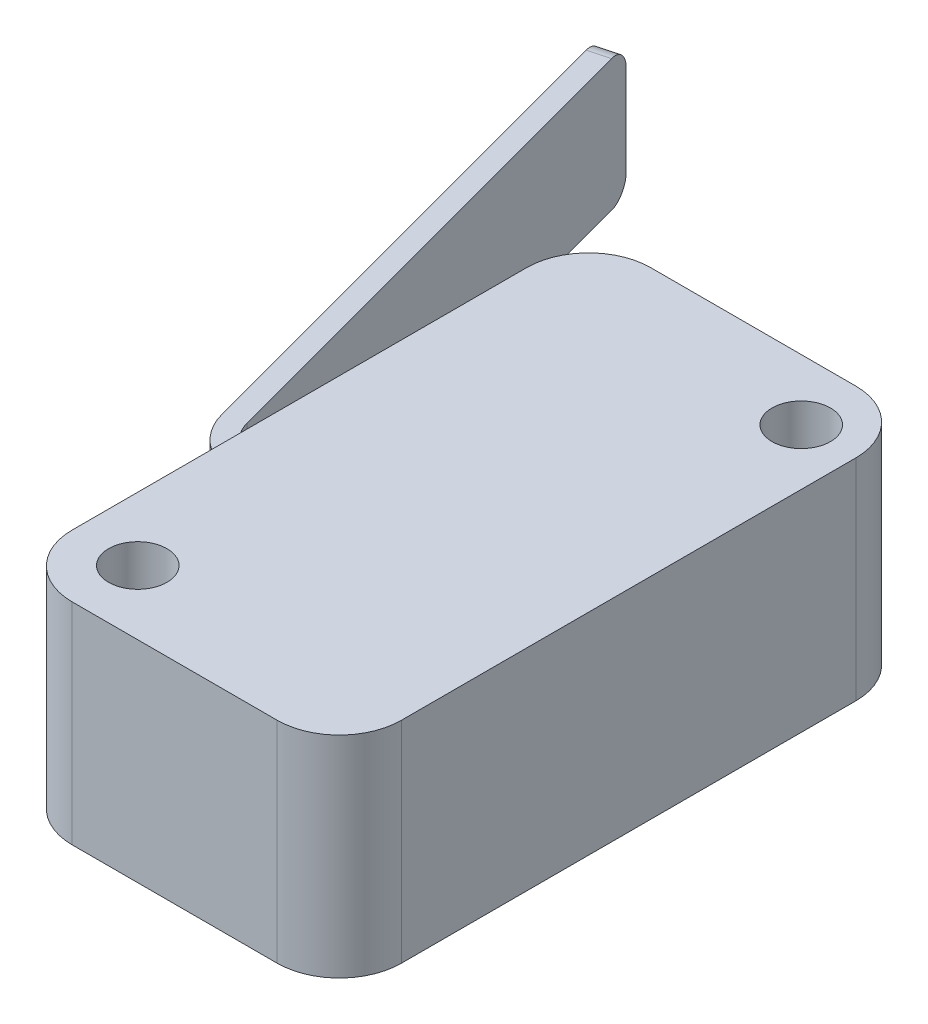
ISO-10303-21;
HEADER;
FILE_DESCRIPTION(('STEP AP214'),'2;1');
FILE_NAME('part.step','',(''),(''),'','','');
FILE_SCHEMA(('AUTOMOTIVE_DESIGN { 1 0 10303 214 1 1 1 1 }'));
ENDSEC;
DATA;
#1=APPLICATION_CONTEXT('core data for automotive mechanical design processes');
#2=APPLICATION_PROTOCOL_DEFINITION('international standard','automotive_design',2000,#1);
#3=PRODUCT_CONTEXT('',#1,'mechanical');
#4=PRODUCT('Part','Part','',(#3));
#5=PRODUCT_RELATED_PRODUCT_CATEGORY('part','',(#4));
#6=PRODUCT_DEFINITION_FORMATION('','',#4);
#7=PRODUCT_DEFINITION_CONTEXT('part definition',#1,'design');
#8=PRODUCT_DEFINITION('design','',#6,#7);
#9=PRODUCT_DEFINITION_SHAPE('','',#8);
#10=(LENGTH_UNIT() NAMED_UNIT(*) SI_UNIT(.MILLI.,.METRE.));
#11=(NAMED_UNIT(*) PLANE_ANGLE_UNIT() SI_UNIT($,.RADIAN.));
#12=(NAMED_UNIT(*) SI_UNIT($,.STERADIAN.) SOLID_ANGLE_UNIT());
#13=UNCERTAINTY_MEASURE_WITH_UNIT(LENGTH_MEASURE(1.E-05),#10,'distance_accuracy_value','');
#14=(GEOMETRIC_REPRESENTATION_CONTEXT(3) GLOBAL_UNCERTAINTY_ASSIGNED_CONTEXT((#13)) GLOBAL_UNIT_ASSIGNED_CONTEXT((#10,
#11,#12)) REPRESENTATION_CONTEXT('',''));
#15=CARTESIAN_POINT('',(0.,0.,0.));
#16=DIRECTION('',(0.,0.,1.));
#17=DIRECTION('',(1.,0.,0.));
#18=AXIS2_PLACEMENT_3D('',#15,#16,#17);
#19=CARTESIAN_POINT('',(-7.9502,5.08,13.97));
#20=DIRECTION('',(1.,0.,0.));
#21=DIRECTION('',(0.,0.,-1.));
#22=AXIS2_PLACEMENT_3D('',#19,#20,#21);
#23=PLANE('',#22);
#24=DIRECTION('',(0.,0.,1.));
#25=VECTOR('',#24,1.);
#26=CARTESIAN_POINT('',(-7.9502,5.08,13.97));
#27=LINE('',#26,#25);
#28=CARTESIAN_POINT('',(-7.9502,5.08,-10.97));
#29=VERTEX_POINT('',#28);
#30=CARTESIAN_POINT('',(-7.9502,5.08,10.97));
#31=VERTEX_POINT('',#30);
#32=EDGE_CURVE('E228',#29,#31,#27,.T.);
#33=ORIENTED_EDGE('',*,*,#32,.F.);
#34=DIRECTION('',(0.,-1.,0.));
#35=VECTOR('',#34,1.);
#36=CARTESIAN_POINT('',(-7.9502,5.08,-10.97));
#37=LINE('',#36,#35);
#38=CARTESIAN_POINT('',(-7.9502,-5.08,-10.97));
#39=VERTEX_POINT('',#38);
#40=EDGE_CURVE('E272',#29,#39,#37,.T.);
#41=ORIENTED_EDGE('',*,*,#40,.T.);
#42=DIRECTION('',(0.,0.,1.));
#43=VECTOR('',#42,1.);
#44=CARTESIAN_POINT('',(-7.9502,-5.08,13.97));
#45=LINE('',#44,#43);
#46=CARTESIAN_POINT('',(-7.9502,-5.08,10.97));
#47=VERTEX_POINT('',#46);
#48=EDGE_CURVE('E240',#39,#47,#45,.T.);
#49=ORIENTED_EDGE('',*,*,#48,.T.);
#50=DIRECTION('',(0.,-1.,0.));
#51=VECTOR('',#50,1.);
#52=CARTESIAN_POINT('',(-7.9502,5.08,10.97));
#53=LINE('',#52,#51);
#54=EDGE_CURVE('E270',#47,#31,#53,.F.);
#55=ORIENTED_EDGE('',*,*,#54,.T.);
#56=EDGE_LOOP('',(#33,#41,#49,#55));
#57=FACE_BOUND('',#56,.T.);
#58=DIRECTION('',(0.,0.,1.));
#59=VECTOR('',#58,1.);
#60=CARTESIAN_POINT('',(-7.9502,-3.175,13.97));
#61=LINE('',#60,#59);
#62=CARTESIAN_POINT('',(-7.9502,-3.175,1.84436190979496));
#63=VERTEX_POINT('',#62);
#64=CARTESIAN_POINT('',(-7.9502,-3.175,2.84436190979496));
#65=VERTEX_POINT('',#64);
#66=EDGE_CURVE('E289',#63,#65,#61,.T.);
#67=ORIENTED_EDGE('',*,*,#66,.F.);
#68=DIRECTION('',(0.,1.,0.));
#69=VECTOR('',#68,1.);
#70=CARTESIAN_POINT('',(-7.9502,5.08,1.84436190979496));
#71=LINE('',#70,#69);
#72=CARTESIAN_POINT('',(-7.9502,3.175,1.84436190979496));
#73=VERTEX_POINT('',#72);
#74=EDGE_CURVE('E286',#63,#73,#71,.T.);
#75=ORIENTED_EDGE('',*,*,#74,.T.);
#76=DIRECTION('',(0.,0.,1.));
#77=VECTOR('',#76,1.);
#78=CARTESIAN_POINT('',(-7.9502,3.175,13.97));
#79=LINE('',#78,#77);
#80=CARTESIAN_POINT('',(-7.9502,3.175,2.84436190979496));
#81=VERTEX_POINT('',#80);
#82=EDGE_CURVE('E280',#73,#81,#79,.T.);
#83=ORIENTED_EDGE('',*,*,#82,.T.);
#84=DIRECTION('',(0.,-1.,0.));
#85=VECTOR('',#84,1.);
#86=CARTESIAN_POINT('',(-7.9502,5.08,2.84436190979496));
#87=LINE('',#86,#85);
#88=EDGE_CURVE('E283',#81,#65,#87,.T.);
#89=ORIENTED_EDGE('',*,*,#88,.T.);
#90=EDGE_LOOP('',(#67,#75,#83,#89));
#91=FACE_BOUND('',#90,.T.);
#92=ADVANCED_FACE('F33',(#57,#91),#23,.F.);
#93=CARTESIAN_POINT('',(7.9502,5.08,13.97));
#94=DIRECTION('',(-1.,0.,0.));
#95=DIRECTION('',(0.,0.,1.));
#96=AXIS2_PLACEMENT_3D('',#93,#94,#95);
#97=PLANE('',#96);
#98=DIRECTION('',(0.,0.,-1.));
#99=VECTOR('',#98,1.);
#100=CARTESIAN_POINT('',(7.9502,-5.08,13.97));
#101=LINE('',#100,#99);
#102=CARTESIAN_POINT('',(7.9502,-5.08,10.97));
#103=VERTEX_POINT('',#102);
#104=CARTESIAN_POINT('',(7.9502,-5.08,-10.97));
#105=VERTEX_POINT('',#104);
#106=EDGE_CURVE('E212',#103,#105,#101,.T.);
#107=ORIENTED_EDGE('',*,*,#106,.T.);
#108=DIRECTION('',(0.,-1.,0.));
#109=VECTOR('',#108,1.);
#110=CARTESIAN_POINT('',(7.9502,5.08,-10.97));
#111=LINE('',#110,#109);
#112=CARTESIAN_POINT('',(7.9502,5.08,-10.97));
#113=VERTEX_POINT('',#112);
#114=EDGE_CURVE('E260',#105,#113,#111,.F.);
#115=ORIENTED_EDGE('',*,*,#114,.T.);
#116=DIRECTION('',(0.,0.,-1.));
#117=VECTOR('',#116,1.);
#118=CARTESIAN_POINT('',(7.9502,5.08,13.97));
#119=LINE('',#118,#117);
#120=CARTESIAN_POINT('',(7.9502,5.08,10.97));
#121=VERTEX_POINT('',#120);
#122=EDGE_CURVE('E221',#121,#113,#119,.T.);
#123=ORIENTED_EDGE('',*,*,#122,.F.);
#124=DIRECTION('',(0.,-1.,0.));
#125=VECTOR('',#124,1.);
#126=CARTESIAN_POINT('',(7.9502,5.08,10.97));
#127=LINE('',#126,#125);
#128=EDGE_CURVE('E257',#121,#103,#127,.T.);
#129=ORIENTED_EDGE('',*,*,#128,.T.);
#130=EDGE_LOOP('',(#107,#115,#123,#129));
#131=FACE_BOUND('',#130,.T.);
#132=ADVANCED_FACE('F358',(#131),#97,.F.);
#133=CARTESIAN_POINT('',(-7.9502,5.08,-13.97));
#134=DIRECTION('',(0.,0.,1.));
#135=DIRECTION('',(1.,0.,0.));
#136=AXIS2_PLACEMENT_3D('',#133,#134,#135);
#137=PLANE('',#136);
#138=DIRECTION('',(-1.,0.,0.));
#139=VECTOR('',#138,1.);
#140=CARTESIAN_POINT('',(-7.9502,5.08,-13.97));
#141=LINE('',#140,#139);
#142=CARTESIAN_POINT('',(4.9502,5.08,-13.97));
#143=VERTEX_POINT('',#142);
#144=CARTESIAN_POINT('',(-4.9502,5.08,-13.97));
#145=VERTEX_POINT('',#144);
#146=EDGE_CURVE('E224',#143,#145,#141,.T.);
#147=ORIENTED_EDGE('',*,*,#146,.F.);
#148=DIRECTION('',(0.,-1.,0.));
#149=VECTOR('',#148,1.);
#150=CARTESIAN_POINT('',(4.9502,5.08,-13.97));
#151=LINE('',#150,#149);
#152=CARTESIAN_POINT('',(4.9502,-5.08,-13.97));
#153=VERTEX_POINT('',#152);
#154=EDGE_CURVE('E246',#143,#153,#151,.T.);
#155=ORIENTED_EDGE('',*,*,#154,.T.);
#156=DIRECTION('',(-1.,0.,0.));
#157=VECTOR('',#156,1.);
#158=CARTESIAN_POINT('',(-7.9502,-5.08,-13.97));
#159=LINE('',#158,#157);
#160=CARTESIAN_POINT('',(-4.9502,-5.08,-13.97));
#161=VERTEX_POINT('',#160);
#162=EDGE_CURVE('E237',#153,#161,#159,.T.);
#163=ORIENTED_EDGE('',*,*,#162,.T.);
#164=DIRECTION('',(0.,-1.,0.));
#165=VECTOR('',#164,1.);
#166=CARTESIAN_POINT('',(-4.9502,5.08,-13.97));
#167=LINE('',#166,#165);
#168=EDGE_CURVE('E234',#161,#145,#167,.F.);
#169=ORIENTED_EDGE('',*,*,#168,.T.);
#170=EDGE_LOOP('',(#147,#155,#163,#169));
#171=FACE_BOUND('',#170,.T.);
#172=ADVANCED_FACE('F335',(#171),#137,.F.);
#173=CARTESIAN_POINT('',(-7.9502,5.08,13.97));
#174=DIRECTION('',(0.,0.,-1.));
#175=DIRECTION('',(-1.,0.,0.));
#176=AXIS2_PLACEMENT_3D('',#173,#174,#175);
#177=PLANE('',#176);
#178=DIRECTION('',(1.,0.,0.));
#179=VECTOR('',#178,1.);
#180=CARTESIAN_POINT('',(-7.9502,-5.08,13.97));
#181=LINE('',#180,#179);
#182=CARTESIAN_POINT('',(-4.9502,-5.08,13.97));
#183=VERTEX_POINT('',#182);
#184=CARTESIAN_POINT('',(4.9502,-5.08,13.97));
#185=VERTEX_POINT('',#184);
#186=EDGE_CURVE('E225',#183,#185,#181,.T.);
#187=ORIENTED_EDGE('',*,*,#186,.T.);
#188=DIRECTION('',(0.,-1.,0.));
#189=VECTOR('',#188,1.);
#190=CARTESIAN_POINT('',(4.9502,5.08,13.97));
#191=LINE('',#190,#189);
#192=CARTESIAN_POINT('',(4.9502,5.08,13.97));
#193=VERTEX_POINT('',#192);
#194=EDGE_CURVE('E278',#185,#193,#191,.F.);
#195=ORIENTED_EDGE('',*,*,#194,.T.);
#196=DIRECTION('',(1.,0.,0.));
#197=VECTOR('',#196,1.);
#198=CARTESIAN_POINT('',(-7.9502,5.08,13.97));
#199=LINE('',#198,#197);
#200=CARTESIAN_POINT('',(-4.9502,5.08,13.97));
#201=VERTEX_POINT('',#200);
#202=EDGE_CURVE('E231',#201,#193,#199,.T.);
#203=ORIENTED_EDGE('',*,*,#202,.F.);
#204=DIRECTION('',(0.,-1.,0.));
#205=VECTOR('',#204,1.);
#206=CARTESIAN_POINT('',(-4.9502,5.08,13.97));
#207=LINE('',#206,#205);
#208=EDGE_CURVE('E275',#201,#183,#207,.T.);
#209=ORIENTED_EDGE('',*,*,#208,.T.);
#210=EDGE_LOOP('',(#187,#195,#203,#209));
#211=FACE_BOUND('',#210,.T.);
#212=ADVANCED_FACE('F320',(#211),#177,.F.);
#213=CARTESIAN_POINT('',(0.,5.08,0.));
#214=DIRECTION('',(0.,-1.,0.));
#215=DIRECTION('',(0.,0.,-1.));
#216=AXIS2_PLACEMENT_3D('',#213,#214,#215);
#217=PLANE('',#216);
#218=CARTESIAN_POINT('',(-4.88443082864765,5.08,10.8661080622666));
#219=DIRECTION('',(0.,1.,0.));
#220=DIRECTION('',(0.,0.,1.));
#221=AXIS2_PLACEMENT_3D('',#218,#219,#220);
#222=CIRCLE('',#221,1.4097);
#223=CARTESIAN_POINT('',(-4.88443082864765,5.08,12.2758080622667));
#224=VERTEX_POINT('',#223);
#225=EDGE_CURVE('E309',#224,#224,#222,.T.);
#226=ORIENTED_EDGE('',*,*,#225,.F.);
#227=EDGE_LOOP('',(#226));
#228=FACE_BOUND('',#227,.T.);
#229=CARTESIAN_POINT('',(5.2482497851196,5.08,-11.0333367612759));
#230=DIRECTION('',(0.,1.,0.));
#231=DIRECTION('',(0.,0.,1.));
#232=AXIS2_PLACEMENT_3D('',#229,#230,#231);
#233=CIRCLE('',#232,1.4097);
#234=CARTESIAN_POINT('',(5.2482497851196,5.08,-9.62363676127591));
#235=VERTEX_POINT('',#234);
#236=EDGE_CURVE('E302',#235,#235,#233,.T.);
#237=ORIENTED_EDGE('',*,*,#236,.F.);
#238=EDGE_LOOP('',(#237));
#239=FACE_BOUND('',#238,.T.);
#240=ORIENTED_EDGE('',*,*,#122,.T.);
#241=CARTESIAN_POINT('',(4.9502,5.08,-10.97));
#242=DIRECTION('',(0.,-1.,0.));
#243=DIRECTION('',(0.,0.,-1.));
#244=AXIS2_PLACEMENT_3D('',#241,#242,#243);
#245=CIRCLE('',#244,3.);
#246=EDGE_CURVE('E268',#113,#143,#245,.F.);
#247=ORIENTED_EDGE('',*,*,#246,.T.);
#248=ORIENTED_EDGE('',*,*,#146,.T.);
#249=CARTESIAN_POINT('',(-4.9502,5.08,-10.97));
#250=DIRECTION('',(0.,-1.,0.));
#251=DIRECTION('',(0.,0.,-1.));
#252=AXIS2_PLACEMENT_3D('',#249,#250,#251);
#253=CIRCLE('',#252,3.);
#254=EDGE_CURVE('E266',#145,#29,#253,.F.);
#255=ORIENTED_EDGE('',*,*,#254,.T.);
#256=ORIENTED_EDGE('',*,*,#32,.T.);
#257=CARTESIAN_POINT('',(-4.9502,5.08,10.97));
#258=DIRECTION('',(0.,-1.,0.));
#259=DIRECTION('',(0.,0.,-1.));
#260=AXIS2_PLACEMENT_3D('',#257,#258,#259);
#261=CIRCLE('',#260,3.);
#262=EDGE_CURVE('E262',#31,#201,#261,.F.);
#263=ORIENTED_EDGE('',*,*,#262,.T.);
#264=ORIENTED_EDGE('',*,*,#202,.T.);
#265=CARTESIAN_POINT('',(4.9502,5.08,10.97));
#266=DIRECTION('',(0.,-1.,0.));
#267=DIRECTION('',(0.,0.,-1.));
#268=AXIS2_PLACEMENT_3D('',#265,#266,#267);
#269=CIRCLE('',#268,3.);
#270=EDGE_CURVE('E264',#193,#121,#269,.F.);
#271=ORIENTED_EDGE('',*,*,#270,.T.);
#272=EDGE_LOOP('',(#240,#247,#248,#255,#256,#263,#264,#271));
#273=FACE_BOUND('',#272,.T.);
#274=ADVANCED_FACE('F316',(#228,#239,#273),#217,.F.);
#275=CARTESIAN_POINT('',(0.,-5.08,0.));
#276=DIRECTION('',(0.,-1.,0.));
#277=DIRECTION('',(0.,0.,-1.));
#278=AXIS2_PLACEMENT_3D('',#275,#276,#277);
#279=PLANE('',#278);
#280=CARTESIAN_POINT('',(-4.88443082864765,-5.08,10.8661080622666));
#281=DIRECTION('',(0.,-1.,0.));
#282=DIRECTION('',(0.,0.,-1.));
#283=AXIS2_PLACEMENT_3D('',#280,#281,#282);
#284=CIRCLE('',#283,1.4097);
#285=CARTESIAN_POINT('',(-4.88443082864765,-5.08,9.45640806226665));
#286=VERTEX_POINT('',#285);
#287=EDGE_CURVE('E37',#286,#286,#284,.T.);
#288=ORIENTED_EDGE('',*,*,#287,.F.);
#289=EDGE_LOOP('',(#288));
#290=FACE_BOUND('',#289,.T.);
#291=CARTESIAN_POINT('',(5.2482497851196,-5.08,-11.0333367612759));
#292=DIRECTION('',(0.,-1.,0.));
#293=DIRECTION('',(0.,0.,-1.));
#294=AXIS2_PLACEMENT_3D('',#291,#292,#293);
#295=CIRCLE('',#294,1.4097);
#296=CARTESIAN_POINT('',(5.2482497851196,-5.08,-12.4430367612759));
#297=VERTEX_POINT('',#296);
#298=EDGE_CURVE('E200',#297,#297,#295,.T.);
#299=ORIENTED_EDGE('',*,*,#298,.F.);
#300=EDGE_LOOP('',(#299));
#301=FACE_BOUND('',#300,.T.);
#302=ORIENTED_EDGE('',*,*,#162,.F.);
#303=CARTESIAN_POINT('',(4.9502,-5.08,-10.97));
#304=DIRECTION('',(0.,-1.,0.));
#305=DIRECTION('',(0.,0.,-1.));
#306=AXIS2_PLACEMENT_3D('',#303,#304,#305);
#307=CIRCLE('',#306,3.);
#308=EDGE_CURVE('E255',#153,#105,#307,.T.);
#309=ORIENTED_EDGE('',*,*,#308,.T.);
#310=ORIENTED_EDGE('',*,*,#106,.F.);
#311=CARTESIAN_POINT('',(4.9502,-5.08,10.97));
#312=DIRECTION('',(0.,-1.,0.));
#313=DIRECTION('',(0.,0.,-1.));
#314=AXIS2_PLACEMENT_3D('',#311,#312,#313);
#315=CIRCLE('',#314,3.);
#316=EDGE_CURVE('E251',#103,#185,#315,.T.);
#317=ORIENTED_EDGE('',*,*,#316,.T.);
#318=ORIENTED_EDGE('',*,*,#186,.F.);
#319=CARTESIAN_POINT('',(-4.9502,-5.08,10.97));
#320=DIRECTION('',(0.,-1.,0.));
#321=DIRECTION('',(0.,0.,-1.));
#322=AXIS2_PLACEMENT_3D('',#319,#320,#321);
#323=CIRCLE('',#322,3.);
#324=EDGE_CURVE('E249',#183,#47,#323,.T.);
#325=ORIENTED_EDGE('',*,*,#324,.T.);
#326=ORIENTED_EDGE('',*,*,#48,.F.);
#327=CARTESIAN_POINT('',(-4.9502,-5.08,-10.97));
#328=DIRECTION('',(0.,-1.,0.));
#329=DIRECTION('',(0.,0.,-1.));
#330=AXIS2_PLACEMENT_3D('',#327,#328,#329);
#331=CIRCLE('',#330,3.);
#332=EDGE_CURVE('E253',#39,#161,#331,.T.);
#333=ORIENTED_EDGE('',*,*,#332,.T.);
#334=EDGE_LOOP('',(#302,#309,#310,#317,#318,#325,#326,#333));
#335=FACE_BOUND('',#334,.T.);
#336=ADVANCED_FACE('F319',(#290,#301,#335),#279,.T.);
#337=CARTESIAN_POINT('',(4.9502,5.08,-10.97));
#338=DIRECTION('',(0.,-1.,0.));
#339=DIRECTION('',(0.,0.,-1.));
#340=AXIS2_PLACEMENT_3D('',#337,#338,#339);
#341=CYLINDRICAL_SURFACE('',#340,3.);
#342=ORIENTED_EDGE('',*,*,#246,.F.);
#343=ORIENTED_EDGE('',*,*,#114,.F.);
#344=ORIENTED_EDGE('',*,*,#308,.F.);
#345=ORIENTED_EDGE('',*,*,#154,.F.);
#346=EDGE_LOOP('',(#342,#343,#344,#345));
#347=FACE_BOUND('',#346,.T.);
#348=ADVANCED_FACE('F332',(#347),#341,.T.);
#349=CARTESIAN_POINT('',(-4.9502,5.08,-10.97));
#350=DIRECTION('',(0.,-1.,0.));
#351=DIRECTION('',(0.,0.,-1.));
#352=AXIS2_PLACEMENT_3D('',#349,#350,#351);
#353=CYLINDRICAL_SURFACE('',#352,3.);
#354=ORIENTED_EDGE('',*,*,#254,.F.);
#355=ORIENTED_EDGE('',*,*,#168,.F.);
#356=ORIENTED_EDGE('',*,*,#332,.F.);
#357=ORIENTED_EDGE('',*,*,#40,.F.);
#358=EDGE_LOOP('',(#354,#355,#356,#357));
#359=FACE_BOUND('',#358,.T.);
#360=ADVANCED_FACE('F343',(#359),#353,.T.);
#361=CARTESIAN_POINT('',(4.9502,5.08,10.97));
#362=DIRECTION('',(0.,-1.,0.));
#363=DIRECTION('',(0.,0.,-1.));
#364=AXIS2_PLACEMENT_3D('',#361,#362,#363);
#365=CYLINDRICAL_SURFACE('',#364,3.);
#366=ORIENTED_EDGE('',*,*,#270,.F.);
#367=ORIENTED_EDGE('',*,*,#194,.F.);
#368=ORIENTED_EDGE('',*,*,#316,.F.);
#369=ORIENTED_EDGE('',*,*,#128,.F.);
#370=EDGE_LOOP('',(#366,#367,#368,#369));
#371=FACE_BOUND('',#370,.T.);
#372=ADVANCED_FACE('F357',(#371),#365,.T.);
#373=CARTESIAN_POINT('',(-4.9502,5.08,10.97));
#374=DIRECTION('',(0.,-1.,0.));
#375=DIRECTION('',(0.,0.,-1.));
#376=AXIS2_PLACEMENT_3D('',#373,#374,#375);
#377=CYLINDRICAL_SURFACE('',#376,3.);
#378=ORIENTED_EDGE('',*,*,#262,.F.);
#379=ORIENTED_EDGE('',*,*,#54,.F.);
#380=ORIENTED_EDGE('',*,*,#324,.F.);
#381=ORIENTED_EDGE('',*,*,#208,.F.);
#382=EDGE_LOOP('',(#378,#379,#380,#381));
#383=FACE_BOUND('',#382,.T.);
#384=ADVANCED_FACE('F352',(#383),#377,.T.);
#385=CARTESIAN_POINT('',(-8.17666771892309,-3.175,1.84436190979496));
#386=DIRECTION('',(0.,0.,-1.));
#387=DIRECTION('',(-1.,0.,0.));
#388=AXIS2_PLACEMENT_3D('',#385,#386,#387);
#389=PLANE('',#388);
#390=ORIENTED_EDGE('',*,*,#74,.F.);
#391=DIRECTION('',(-1.,0.,0.));
#392=VECTOR('',#391,1.);
#393=CARTESIAN_POINT('',(-8.17666771892309,-3.175,1.84436190979496));
#394=LINE('',#393,#392);
#395=CARTESIAN_POINT('',(-8.17666771892309,-3.175,1.84436190979496));
#396=VERTEX_POINT('',#395);
#397=EDGE_CURVE('E188',#63,#396,#394,.T.);
#398=ORIENTED_EDGE('',*,*,#397,.T.);
#399=DIRECTION('',(0.,1.,0.));
#400=VECTOR('',#399,1.);
#401=CARTESIAN_POINT('',(-8.17666771892309,-3.175,1.84436190979496));
#402=LINE('',#401,#400);
#403=CARTESIAN_POINT('',(-8.17666771892309,3.175,1.84436190979496));
#404=VERTEX_POINT('',#403);
#405=EDGE_CURVE('E215',#396,#404,#402,.T.);
#406=ORIENTED_EDGE('',*,*,#405,.T.);
#407=DIRECTION('',(-1.,0.,0.));
#408=VECTOR('',#407,1.);
#409=CARTESIAN_POINT('',(-8.17666771892309,3.175,1.84436190979496));
#410=LINE('',#409,#408);
#411=EDGE_CURVE('E204',#73,#404,#410,.T.);
#412=ORIENTED_EDGE('',*,*,#411,.F.);
#413=EDGE_LOOP('',(#390,#398,#406,#412));
#414=FACE_BOUND('',#413,.T.);
#415=ADVANCED_FACE('F375',(#414),#389,.T.);
#416=CARTESIAN_POINT('',(-8.17666771892309,-3.175,2.84436190979496));
#417=DIRECTION('',(0.,0.,1.));
#418=DIRECTION('',(1.,0.,0.));
#419=AXIS2_PLACEMENT_3D('',#416,#417,#418);
#420=PLANE('',#419);
#421=ORIENTED_EDGE('',*,*,#88,.F.);
#422=DIRECTION('',(1.,0.,0.));
#423=VECTOR('',#422,1.);
#424=CARTESIAN_POINT('',(-8.17666771892309,3.175,2.84436190979496));
#425=LINE('',#424,#423);
#426=CARTESIAN_POINT('',(-8.17666771892309,3.175,2.84436190979496));
#427=VERTEX_POINT('',#426);
#428=EDGE_CURVE('E202',#427,#81,#425,.T.);
#429=ORIENTED_EDGE('',*,*,#428,.F.);
#430=DIRECTION('',(0.,1.,0.));
#431=VECTOR('',#430,1.);
#432=CARTESIAN_POINT('',(-8.17666771892309,-3.175,2.84436190979496));
#433=LINE('',#432,#431);
#434=CARTESIAN_POINT('',(-8.17666771892309,-3.175,2.84436190979496));
#435=VERTEX_POINT('',#434);
#436=EDGE_CURVE('E180',#435,#427,#433,.T.);
#437=ORIENTED_EDGE('',*,*,#436,.F.);
#438=DIRECTION('',(1.,0.,0.));
#439=VECTOR('',#438,1.);
#440=CARTESIAN_POINT('',(-8.17666771892309,-3.175,2.84436190979496));
#441=LINE('',#440,#439);
#442=EDGE_CURVE('E186',#435,#65,#441,.T.);
#443=ORIENTED_EDGE('',*,*,#442,.T.);
#444=EDGE_LOOP('',(#421,#429,#437,#443));
#445=FACE_BOUND('',#444,.T.);
#446=ADVANCED_FACE('F407',(#445),#420,.T.);
#447=CARTESIAN_POINT('',(-8.17666771892309,-3.175,-0.155638090205042));
#448=DIRECTION('',(0.,1.,0.));
#449=DIRECTION('',(0.,0.,1.));
#450=AXIS2_PLACEMENT_3D('',#447,#448,#449);
#451=PLANE('',#450);
#452=DIRECTION('',(0.258819045102521,0.,0.965925826289068));
#453=VECTOR('',#452,1.);
#454=CARTESIAN_POINT('',(-17.7731750085684,-3.175,-24.3791809548975));
#455=LINE('',#454,#453);
#456=CARTESIAN_POINT('',(-17.5143559634659,-3.175,-23.4132551286084));
#457=VERTEX_POINT('',#456);
#458=CARTESIAN_POINT('',(-11.0744451977903,-3.175,0.620819045102524));
#459=VERTEX_POINT('',#458);
#460=EDGE_CURVE('E163',#457,#459,#455,.T.);
#461=ORIENTED_EDGE('',*,*,#460,.F.);
#462=DIRECTION('',(-0.965925826289068,0.,0.258819045102524));
#463=VECTOR('',#462,1.);
#464=CARTESIAN_POINT('',(-16.5484301371768,-3.175,-23.6720741737109));
#465=LINE('',#464,#463);
#466=CARTESIAN_POINT('',(-16.5484301371768,-3.175,-23.6720741737109));
#467=VERTEX_POINT('',#466);
#468=EDGE_CURVE('E58',#457,#467,#465,.F.);
#469=ORIENTED_EDGE('',*,*,#468,.T.);
#470=DIRECTION('',(-0.258819045102522,0.,-0.965925826289068));
#471=VECTOR('',#470,1.);
#472=CARTESIAN_POINT('',(-16.8072491822793,-3.175,-24.638));
#473=LINE('',#472,#471);
#474=CARTESIAN_POINT('',(-10.1085193715012,-3.175,0.362000000000008));
#475=VERTEX_POINT('',#474);
#476=EDGE_CURVE('E196',#475,#467,#473,.T.);
#477=ORIENTED_EDGE('',*,*,#476,.F.);
#478=CARTESIAN_POINT('',(-8.17666771892309,-3.175,-0.155638090205042));
#479=DIRECTION('',(0.,-1.,0.));
#480=DIRECTION('',(0.,0.,1.));
#481=AXIS2_PLACEMENT_3D('',#478,#479,#480);
#482=CIRCLE('',#481,2.);
#483=EDGE_CURVE('E193',#396,#475,#482,.T.);
#484=ORIENTED_EDGE('',*,*,#483,.F.);
#485=ORIENTED_EDGE('',*,*,#397,.F.);
#486=ORIENTED_EDGE('',*,*,#66,.T.);
#487=ORIENTED_EDGE('',*,*,#442,.F.);
#488=CARTESIAN_POINT('',(-8.17666771892309,-3.175,-0.155638090205042));
#489=DIRECTION('',(0.,1.,0.));
#490=DIRECTION('',(0.,0.,1.));
#491=AXIS2_PLACEMENT_3D('',#488,#489,#490);
#492=CIRCLE('',#491,3.);
#493=EDGE_CURVE('E172',#459,#435,#492,.T.);
#494=ORIENTED_EDGE('',*,*,#493,.F.);
#495=EDGE_LOOP('',(#461,#469,#477,#484,#485,#486,#487,#494));
#496=FACE_BOUND('',#495,.T.);
#497=ADVANCED_FACE('F184',(#496),#451,.F.);
#498=CARTESIAN_POINT('',(-8.17666771892309,3.175,-0.155638090205042));
#499=DIRECTION('',(0.,1.,0.));
#500=DIRECTION('',(0.,0.,1.));
#501=AXIS2_PLACEMENT_3D('',#498,#499,#500);
#502=PLANE('',#501);
#503=DIRECTION('',(-0.258819045102522,0.,-0.965925826289068));
#504=VECTOR('',#503,1.);
#505=CARTESIAN_POINT('',(-16.8072491822793,3.175,-24.638));
#506=LINE('',#505,#504);
#507=CARTESIAN_POINT('',(-10.1085193715012,3.175,0.362000000000008));
#508=VERTEX_POINT('',#507);
#509=CARTESIAN_POINT('',(-16.5484301371768,3.175,-23.6720741737109));
#510=VERTEX_POINT('',#509);
#511=EDGE_CURVE('E173',#508,#510,#506,.T.);
#512=ORIENTED_EDGE('',*,*,#511,.T.);
#513=DIRECTION('',(-0.965925826289068,0.,0.258819045102524));
#514=VECTOR('',#513,1.);
#515=CARTESIAN_POINT('',(-14.6165784845987,3.175,-24.189712263916));
#516=LINE('',#515,#514);
#517=CARTESIAN_POINT('',(-17.5143559634659,3.175,-23.4132551286084));
#518=VERTEX_POINT('',#517);
#519=EDGE_CURVE('E11',#510,#518,#516,.T.);
#520=ORIENTED_EDGE('',*,*,#519,.T.);
#521=DIRECTION('',(0.258819045102521,0.,0.965925826289068));
#522=VECTOR('',#521,1.);
#523=CARTESIAN_POINT('',(-17.7731750085684,3.175,-24.3791809548975));
#524=LINE('',#523,#522);
#525=CARTESIAN_POINT('',(-11.0744451977903,3.175,0.620819045102524));
#526=VERTEX_POINT('',#525);
#527=EDGE_CURVE('E198',#518,#526,#524,.T.);
#528=ORIENTED_EDGE('',*,*,#527,.T.);
#529=CARTESIAN_POINT('',(-8.17666771892309,3.175,-0.155638090205042));
#530=DIRECTION('',(0.,1.,0.));
#531=DIRECTION('',(0.,0.,1.));
#532=AXIS2_PLACEMENT_3D('',#529,#530,#531);
#533=CIRCLE('',#532,3.);
#534=EDGE_CURVE('E179',#526,#427,#533,.T.);
#535=ORIENTED_EDGE('',*,*,#534,.T.);
#536=ORIENTED_EDGE('',*,*,#428,.T.);
#537=ORIENTED_EDGE('',*,*,#82,.F.);
#538=ORIENTED_EDGE('',*,*,#411,.T.);
#539=CARTESIAN_POINT('',(-8.17666771892309,3.175,-0.155638090205042));
#540=DIRECTION('',(0.,-1.,0.));
#541=DIRECTION('',(0.,0.,1.));
#542=AXIS2_PLACEMENT_3D('',#539,#540,#541);
#543=CIRCLE('',#542,2.);
#544=EDGE_CURVE('E206',#404,#508,#543,.T.);
#545=ORIENTED_EDGE('',*,*,#544,.T.);
#546=EDGE_LOOP('',(#512,#520,#528,#535,#536,#537,#538,#545));
#547=FACE_BOUND('',#546,.T.);
#548=ADVANCED_FACE('F395',(#547),#502,.T.);
#549=CARTESIAN_POINT('',(-17.7731750085684,-3.175,-24.3791809548975));
#550=DIRECTION('',(-0.258819045102524,0.,-0.965925826289068));
#551=DIRECTION('',(-0.965925826289068,0.,0.258819045102524));
#552=AXIS2_PLACEMENT_3D('',#549,#550,#551);
#553=PLANE('',#552);
#554=DIRECTION('',(0.,1.,0.));
#555=VECTOR('',#554,1.);
#556=CARTESIAN_POINT('',(-16.8072491822793,-3.175,-24.638));
#557=LINE('',#556,#555);
#558=CARTESIAN_POINT('',(-16.8072491822793,-2.175,-24.638));
#559=VERTEX_POINT('',#558);
#560=CARTESIAN_POINT('',(-16.8072491822793,2.175,-24.638));
#561=VERTEX_POINT('',#560);
#562=EDGE_CURVE('E210',#559,#561,#557,.T.);
#563=ORIENTED_EDGE('',*,*,#562,.F.);
#564=DIRECTION('',(-0.965925826289068,0.,0.258819045102524));
#565=VECTOR('',#564,1.);
#566=CARTESIAN_POINT('',(-17.7731750085684,-2.175,-24.3791809548975));
#567=LINE('',#566,#565);
#568=CARTESIAN_POINT('',(-17.7731750085684,-2.175,-24.3791809548975));
#569=VERTEX_POINT('',#568);
#570=EDGE_CURVE('E293',#559,#569,#567,.T.);
#571=ORIENTED_EDGE('',*,*,#570,.T.);
#572=DIRECTION('',(0.,1.,0.));
#573=VECTOR('',#572,1.);
#574=CARTESIAN_POINT('',(-17.7731750085684,-3.175,-24.3791809548975));
#575=LINE('',#574,#573);
#576=CARTESIAN_POINT('',(-17.7731750085684,2.175,-24.3791809548975));
#577=VERTEX_POINT('',#576);
#578=EDGE_CURVE('E181',#569,#577,#575,.T.);
#579=ORIENTED_EDGE('',*,*,#578,.T.);
#580=DIRECTION('',(-0.965925826289068,0.,0.258819045102524));
#581=VECTOR('',#580,1.);
#582=CARTESIAN_POINT('',(-17.7731750085684,2.175,-24.3791809548975));
#583=LINE('',#582,#581);
#584=EDGE_CURVE('E291',#577,#561,#583,.F.);
#585=ORIENTED_EDGE('',*,*,#584,.T.);
#586=EDGE_LOOP('',(#563,#571,#579,#585));
#587=FACE_BOUND('',#586,.T.);
#588=ADVANCED_FACE('F391',(#587),#553,.T.);
#589=CARTESIAN_POINT('',(-16.8072491822793,-3.175,-24.638));
#590=DIRECTION('',(0.965925826289068,0.,-0.258819045102522));
#591=DIRECTION('',(-0.258819045102522,0.,-0.965925826289068));
#592=AXIS2_PLACEMENT_3D('',#589,#590,#591);
#593=PLANE('',#592);
#594=ORIENTED_EDGE('',*,*,#476,.T.);
#595=CARTESIAN_POINT('',(-16.5484301371768,-2.175,-23.6720741737109));
#596=DIRECTION('',(0.965925826289068,0.,-0.258819045102522));
#597=DIRECTION('',(-0.258819045102522,0.,-0.965925826289068));
#598=AXIS2_PLACEMENT_3D('',#595,#596,#597);
#599=CIRCLE('',#598,1.);
#600=EDGE_CURVE('E42',#467,#559,#599,.T.);
#601=ORIENTED_EDGE('',*,*,#600,.T.);
#602=ORIENTED_EDGE('',*,*,#562,.T.);
#603=CARTESIAN_POINT('',(-16.5484301371768,2.175,-23.6720741737109));
#604=DIRECTION('',(0.965925826289068,0.,-0.258819045102522));
#605=DIRECTION('',(-0.258819045102522,0.,-0.965925826289068));
#606=AXIS2_PLACEMENT_3D('',#603,#604,#605);
#607=CIRCLE('',#606,1.);
#608=EDGE_CURVE('E50',#561,#510,#607,.T.);
#609=ORIENTED_EDGE('',*,*,#608,.T.);
#610=ORIENTED_EDGE('',*,*,#511,.F.);
#611=DIRECTION('',(0.,1.,0.));
#612=VECTOR('',#611,1.);
#613=CARTESIAN_POINT('',(-10.1085193715012,-3.175,0.362000000000008));
#614=LINE('',#613,#612);
#615=EDGE_CURVE('E213',#475,#508,#614,.T.);
#616=ORIENTED_EDGE('',*,*,#615,.F.);
#617=EDGE_LOOP('',(#594,#601,#602,#609,#610,#616));
#618=FACE_BOUND('',#617,.T.);
#619=ADVANCED_FACE('F389',(#618),#593,.T.);
#620=CARTESIAN_POINT('',(-8.17666771892309,-3.175,-0.155638090205042));
#621=DIRECTION('',(0.,1.,0.));
#622=DIRECTION('',(0.,0.,1.));
#623=AXIS2_PLACEMENT_3D('',#620,#621,#622);
#624=CYLINDRICAL_SURFACE('',#623,2.);
#625=ORIENTED_EDGE('',*,*,#544,.F.);
#626=ORIENTED_EDGE('',*,*,#405,.F.);
#627=ORIENTED_EDGE('',*,*,#483,.T.);
#628=ORIENTED_EDGE('',*,*,#615,.T.);
#629=EDGE_LOOP('',(#625,#626,#627,#628));
#630=FACE_BOUND('',#629,.T.);
#631=ADVANCED_FACE('F400',(#630),#624,.F.);
#632=CARTESIAN_POINT('',(-8.17666771892309,-3.175,-0.155638090205042));
#633=DIRECTION('',(0.,1.,0.));
#634=DIRECTION('',(0.,0.,1.));
#635=AXIS2_PLACEMENT_3D('',#632,#633,#634);
#636=CYLINDRICAL_SURFACE('',#635,3.);
#637=ORIENTED_EDGE('',*,*,#534,.F.);
#638=DIRECTION('',(0.,1.,0.));
#639=VECTOR('',#638,1.);
#640=CARTESIAN_POINT('',(-11.0744451977903,-3.175,0.620819045102524));
#641=LINE('',#640,#639);
#642=EDGE_CURVE('E168',#459,#526,#641,.T.);
#643=ORIENTED_EDGE('',*,*,#642,.F.);
#644=ORIENTED_EDGE('',*,*,#493,.T.);
#645=ORIENTED_EDGE('',*,*,#436,.T.);
#646=EDGE_LOOP('',(#637,#643,#644,#645));
#647=FACE_BOUND('',#646,.T.);
#648=ADVANCED_FACE('F177',(#647),#636,.T.);
#649=CARTESIAN_POINT('',(-17.7731750085684,-3.175,-24.3791809548975));
#650=DIRECTION('',(-0.965925826289068,0.,0.258819045102521));
#651=DIRECTION('',(0.258819045102521,0.,0.965925826289068));
#652=AXIS2_PLACEMENT_3D('',#649,#650,#651);
#653=PLANE('',#652);
#654=ORIENTED_EDGE('',*,*,#578,.F.);
#655=CARTESIAN_POINT('',(-17.5143559634659,-2.175,-23.4132551286084));
#656=DIRECTION('',(-0.965925826289068,0.,0.258819045102521));
#657=DIRECTION('',(0.258819045102521,0.,0.965925826289068));
#658=AXIS2_PLACEMENT_3D('',#655,#656,#657);
#659=CIRCLE('',#658,1.);
#660=EDGE_CURVE('E170',#569,#457,#659,.T.);
#661=ORIENTED_EDGE('',*,*,#660,.T.);
#662=ORIENTED_EDGE('',*,*,#460,.T.);
#663=ORIENTED_EDGE('',*,*,#642,.T.);
#664=ORIENTED_EDGE('',*,*,#527,.F.);
#665=CARTESIAN_POINT('',(-17.5143559634659,2.175,-23.4132551286084));
#666=DIRECTION('',(-0.965925826289068,0.,0.258819045102521));
#667=DIRECTION('',(0.258819045102521,0.,0.965925826289068));
#668=AXIS2_PLACEMENT_3D('',#665,#666,#667);
#669=CIRCLE('',#668,1.);
#670=EDGE_CURVE('E296',#518,#577,#669,.T.);
#671=ORIENTED_EDGE('',*,*,#670,.T.);
#672=EDGE_LOOP('',(#654,#661,#662,#663,#664,#671));
#673=FACE_BOUND('',#672,.T.);
#674=ADVANCED_FACE('F166',(#673),#653,.T.);
#675=CARTESIAN_POINT('',(-17.5143559634659,-2.175,-23.4132551286084));
#676=DIRECTION('',(0.965925826289068,0.,-0.258819045102524));
#677=DIRECTION('',(-0.258819045102524,0.,-0.965925826289068));
#678=AXIS2_PLACEMENT_3D('',#675,#676,#677);
#679=CYLINDRICAL_SURFACE('',#678,1.);
#680=ORIENTED_EDGE('',*,*,#600,.F.);
#681=ORIENTED_EDGE('',*,*,#468,.F.);
#682=ORIENTED_EDGE('',*,*,#660,.F.);
#683=ORIENTED_EDGE('',*,*,#570,.F.);
#684=EDGE_LOOP('',(#680,#681,#682,#683));
#685=FACE_BOUND('',#684,.T.);
#686=ADVANCED_FACE('F376',(#685),#679,.T.);
#687=CARTESIAN_POINT('',(-14.6165784845987,2.175,-24.189712263916));
#688=DIRECTION('',(-0.965925826289068,0.,0.258819045102524));
#689=DIRECTION('',(0.258819045102524,0.,0.965925826289068));
#690=AXIS2_PLACEMENT_3D('',#687,#688,#689);
#691=CYLINDRICAL_SURFACE('',#690,1.);
#692=ORIENTED_EDGE('',*,*,#608,.F.);
#693=ORIENTED_EDGE('',*,*,#584,.F.);
#694=ORIENTED_EDGE('',*,*,#670,.F.);
#695=ORIENTED_EDGE('',*,*,#519,.F.);
#696=EDGE_LOOP('',(#692,#693,#694,#695));
#697=FACE_BOUND('',#696,.T.);
#698=ADVANCED_FACE('F35',(#697),#691,.T.);
#699=CARTESIAN_POINT('',(5.2482497851196,-11.27,-11.0333367612759));
#700=DIRECTION('',(0.,1.,0.));
#701=DIRECTION('',(0.,0.,1.));
#702=AXIS2_PLACEMENT_3D('',#699,#700,#701);
#703=CYLINDRICAL_SURFACE('',#702,1.4097);
#704=ORIENTED_EDGE('',*,*,#298,.T.);
#705=EDGE_LOOP('',(#704));
#706=FACE_BOUND('',#705,.T.);
#707=ORIENTED_EDGE('',*,*,#236,.T.);
#708=EDGE_LOOP('',(#707));
#709=FACE_BOUND('',#708,.T.);
#710=ADVANCED_FACE('F383',(#706,#709),#703,.F.);
#711=CARTESIAN_POINT('',(-4.88443082864765,-11.27,10.8661080622666));
#712=DIRECTION('',(0.,1.,0.));
#713=DIRECTION('',(0.,0.,1.));
#714=AXIS2_PLACEMENT_3D('',#711,#712,#713);
#715=CYLINDRICAL_SURFACE('',#714,1.4097);
#716=ORIENTED_EDGE('',*,*,#287,.T.);
#717=EDGE_LOOP('',(#716));
#718=FACE_BOUND('',#717,.T.);
#719=ORIENTED_EDGE('',*,*,#225,.T.);
#720=EDGE_LOOP('',(#719));
#721=FACE_BOUND('',#720,.T.);
#722=ADVANCED_FACE('F314',(#718,#721),#715,.F.);
#723=CLOSED_SHELL('',(#92,#132,#172,#212,#274,#336,#348,#360,#372,#384,#415,#446,#497,#548,#588,
#619,#631,#648,#674,#686,#698,#710,#722));
#724=MANIFOLD_SOLID_BREP('B2',#723);
#725=ADVANCED_BREP_SHAPE_REPRESENTATION('',(#18,#724),#14);
#726=SHAPE_DEFINITION_REPRESENTATION(#9,#725);
ENDSEC;
END-ISO-10303-21;
